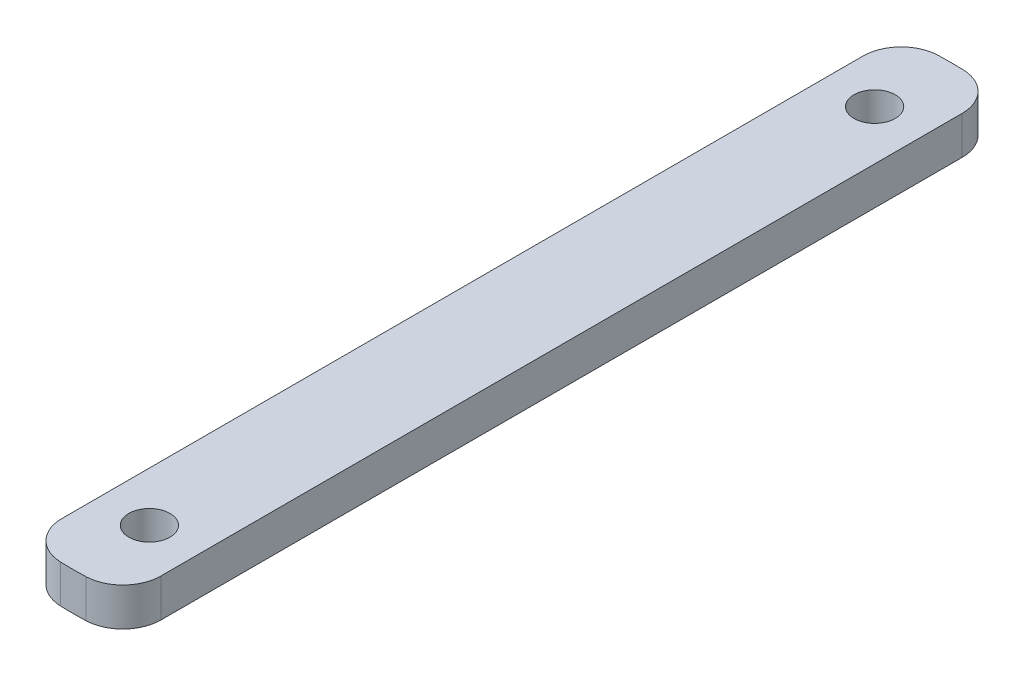
ISO-10303-21;
HEADER;
FILE_DESCRIPTION(('STEP AP214'),'2;1');
FILE_NAME('part.step','',(''),(''),'','','');
FILE_SCHEMA(('AUTOMOTIVE_DESIGN { 1 0 10303 214 1 1 1 1 }'));
ENDSEC;
DATA;
#1=APPLICATION_CONTEXT('core data for automotive mechanical design processes');
#2=APPLICATION_PROTOCOL_DEFINITION('international standard','automotive_design',2000,#1);
#3=PRODUCT_CONTEXT('',#1,'mechanical');
#4=PRODUCT('Part','Part','',(#3));
#5=PRODUCT_RELATED_PRODUCT_CATEGORY('part','',(#4));
#6=PRODUCT_DEFINITION_FORMATION('','',#4);
#7=PRODUCT_DEFINITION_CONTEXT('part definition',#1,'design');
#8=PRODUCT_DEFINITION('design','',#6,#7);
#9=PRODUCT_DEFINITION_SHAPE('','',#8);
#10=(LENGTH_UNIT() NAMED_UNIT(*) SI_UNIT(.MILLI.,.METRE.));
#11=(NAMED_UNIT(*) PLANE_ANGLE_UNIT() SI_UNIT($,.RADIAN.));
#12=(NAMED_UNIT(*) SI_UNIT($,.STERADIAN.) SOLID_ANGLE_UNIT());
#13=UNCERTAINTY_MEASURE_WITH_UNIT(LENGTH_MEASURE(1.E-05),#10,'distance_accuracy_value','');
#14=(GEOMETRIC_REPRESENTATION_CONTEXT(3) GLOBAL_UNCERTAINTY_ASSIGNED_CONTEXT((#13)) GLOBAL_UNIT_ASSIGNED_CONTEXT((#10,
#11,#12)) REPRESENTATION_CONTEXT('',''));
#15=CARTESIAN_POINT('',(0.,0.,0.));
#16=DIRECTION('',(0.,0.,1.));
#17=DIRECTION('',(1.,0.,0.));
#18=AXIS2_PLACEMENT_3D('',#15,#16,#17);
#19=CARTESIAN_POINT('',(0.,6.35,0.));
#20=DIRECTION('',(0.,-1.,0.));
#21=DIRECTION('',(0.,0.,-1.));
#22=AXIS2_PLACEMENT_3D('',#19,#20,#21);
#23=CYLINDRICAL_SURFACE('',#22,73.025);
#24=CARTESIAN_POINT('',(0.,6.35,0.));
#25=DIRECTION('',(0.,1.,0.));
#26=DIRECTION('',(0.,0.,1.));
#27=AXIS2_PLACEMENT_3D('',#24,#25,#26);
#28=CIRCLE('',#27,73.025);
#29=CARTESIAN_POINT('',(-2.08642857142859,6.35,72.9951877921848));
#30=VERTEX_POINT('',#29);
#31=CARTESIAN_POINT('',(2.08642857142859,6.35,72.9951877921848));
#32=VERTEX_POINT('',#31);
#33=EDGE_CURVE('E126',#30,#32,#28,.T.);
#34=ORIENTED_EDGE('',*,*,#33,.F.);
#35=DIRECTION('',(0.,-1.,0.));
#36=VECTOR('',#35,1.);
#37=CARTESIAN_POINT('',(-2.08642857142859,6.35,72.9951877921848));
#38=LINE('',#37,#36);
#39=CARTESIAN_POINT('',(-2.08642857142859,0.,72.9951877921848));
#40=VERTEX_POINT('',#39);
#41=EDGE_CURVE('E109',#30,#40,#38,.T.);
#42=ORIENTED_EDGE('',*,*,#41,.T.);
#43=CARTESIAN_POINT('',(0.,0.,0.));
#44=DIRECTION('',(0.,1.,0.));
#45=DIRECTION('',(0.,0.,1.));
#46=AXIS2_PLACEMENT_3D('',#43,#44,#45);
#47=CIRCLE('',#46,73.025);
#48=CARTESIAN_POINT('',(2.08642857142859,0.,72.9951877921848));
#49=VERTEX_POINT('',#48);
#50=EDGE_CURVE('E123',#40,#49,#47,.T.);
#51=ORIENTED_EDGE('',*,*,#50,.T.);
#52=DIRECTION('',(0.,-1.,0.));
#53=VECTOR('',#52,1.);
#54=CARTESIAN_POINT('',(2.08642857142859,6.35,72.9951877921848));
#55=LINE('',#54,#53);
#56=EDGE_CURVE('E129',#49,#32,#55,.F.);
#57=ORIENTED_EDGE('',*,*,#56,.T.);
#58=EDGE_LOOP('',(#34,#42,#51,#57));
#59=FACE_BOUND('',#58,.T.);
#60=ADVANCED_FACE('F37',(#59),#23,.T.);
#61=CARTESIAN_POINT('',(0.,6.35,0.));
#62=DIRECTION('',(0.,1.,0.));
#63=DIRECTION('',(0.,0.,1.));
#64=AXIS2_PLACEMENT_3D('',#61,#62,#63);
#65=PLANE('',#64);
#66=DIRECTION('',(0.,0.,-1.));
#67=VECTOR('',#66,1.);
#68=CARTESIAN_POINT('',(-8.25500000000002,6.35,-73.025));
#69=LINE('',#68,#67);
#70=CARTESIAN_POINT('',(-8.25500000000002,6.35,66.6477801580818));
#71=VERTEX_POINT('',#70);
#72=CARTESIAN_POINT('',(-8.25500000000002,6.35,-66.6477801580818));
#73=VERTEX_POINT('',#72);
#74=EDGE_CURVE('E212',#71,#73,#69,.T.);
#75=ORIENTED_EDGE('',*,*,#74,.F.);
#76=CARTESIAN_POINT('',(-1.90500000000002,6.35,66.6477801580818));
#77=DIRECTION('',(0.,1.,0.));
#78=DIRECTION('',(0.,0.,1.));
#79=AXIS2_PLACEMENT_3D('',#76,#77,#78);
#80=CIRCLE('',#79,6.35);
#81=EDGE_CURVE('E170',#71,#30,#80,.T.);
#82=ORIENTED_EDGE('',*,*,#81,.T.);
#83=ORIENTED_EDGE('',*,*,#33,.T.);
#84=CARTESIAN_POINT('',(1.90500000000002,6.35,66.6477801580818));
#85=DIRECTION('',(0.,1.,0.));
#86=DIRECTION('',(0.,0.,1.));
#87=AXIS2_PLACEMENT_3D('',#84,#85,#86);
#88=CIRCLE('',#87,6.35);
#89=CARTESIAN_POINT('',(8.25500000000002,6.35,66.6477801580818));
#90=VERTEX_POINT('',#89);
#91=EDGE_CURVE('E163',#32,#90,#88,.T.);
#92=ORIENTED_EDGE('',*,*,#91,.T.);
#93=DIRECTION('',(0.,0.,1.));
#94=VECTOR('',#93,1.);
#95=CARTESIAN_POINT('',(8.25500000000002,6.35,-73.025));
#96=LINE('',#95,#94);
#97=CARTESIAN_POINT('',(8.25500000000002,6.35,-66.6477801580818));
#98=VERTEX_POINT('',#97);
#99=EDGE_CURVE('E188',#98,#90,#96,.T.);
#100=ORIENTED_EDGE('',*,*,#99,.F.);
#101=CARTESIAN_POINT('',(1.90500000000002,6.35,-66.6477801580818));
#102=DIRECTION('',(0.,1.,0.));
#103=DIRECTION('',(0.,0.,1.));
#104=AXIS2_PLACEMENT_3D('',#101,#102,#103);
#105=CIRCLE('',#104,6.35);
#106=CARTESIAN_POINT('',(2.08642857142859,6.35,-72.9951877921848));
#107=VERTEX_POINT('',#106);
#108=EDGE_CURVE('E61',#98,#107,#105,.T.);
#109=ORIENTED_EDGE('',*,*,#108,.T.);
#110=CARTESIAN_POINT('',(-2.08642857142859,6.35,-72.9951877921848));
#111=VERTEX_POINT('',#110);
#112=EDGE_CURVE('E148',#107,#111,#28,.T.);
#113=ORIENTED_EDGE('',*,*,#112,.T.);
#114=CARTESIAN_POINT('',(-1.90500000000002,6.35,-66.6477801580818));
#115=DIRECTION('',(0.,1.,0.));
#116=DIRECTION('',(0.,0.,1.));
#117=AXIS2_PLACEMENT_3D('',#114,#115,#116);
#118=CIRCLE('',#117,6.35);
#119=EDGE_CURVE('E53',#111,#73,#118,.T.);
#120=ORIENTED_EDGE('',*,*,#119,.T.);
#121=EDGE_LOOP('',(#75,#82,#83,#92,#100,#109,#113,#120));
#122=FACE_BOUND('',#121,.T.);
#123=CARTESIAN_POINT('',(0.,6.35,-60.325));
#124=DIRECTION('',(0.,1.,0.));
#125=DIRECTION('',(0.,0.,1.));
#126=AXIS2_PLACEMENT_3D('',#123,#124,#125);
#127=CIRCLE('',#126,3.429);
#128=CARTESIAN_POINT('',(0.,6.35,-56.896));
#129=VERTEX_POINT('',#128);
#130=EDGE_CURVE('E137',#129,#129,#127,.T.);
#131=ORIENTED_EDGE('',*,*,#130,.F.);
#132=EDGE_LOOP('',(#131));
#133=FACE_BOUND('',#132,.T.);
#134=CARTESIAN_POINT('',(0.,6.35,60.325));
#135=DIRECTION('',(0.,1.,0.));
#136=DIRECTION('',(0.,0.,-1.));
#137=AXIS2_PLACEMENT_3D('',#134,#135,#136);
#138=CIRCLE('',#137,3.429);
#139=CARTESIAN_POINT('',(0.,6.35,56.896));
#140=VERTEX_POINT('',#139);
#141=EDGE_CURVE('E217',#140,#140,#138,.T.);
#142=ORIENTED_EDGE('',*,*,#141,.F.);
#143=EDGE_LOOP('',(#142));
#144=FACE_BOUND('',#143,.T.);
#145=ADVANCED_FACE('F195',(#122,#133,#144),#65,.T.);
#146=CARTESIAN_POINT('',(0.,0.,0.));
#147=DIRECTION('',(0.,1.,0.));
#148=DIRECTION('',(0.,0.,1.));
#149=AXIS2_PLACEMENT_3D('',#146,#147,#148);
#150=PLANE('',#149);
#151=ORIENTED_EDGE('',*,*,#50,.F.);
#152=CARTESIAN_POINT('',(-1.90500000000002,0.,66.6477801580818));
#153=DIRECTION('',(0.,1.,0.));
#154=DIRECTION('',(0.,0.,1.));
#155=AXIS2_PLACEMENT_3D('',#152,#153,#154);
#156=CIRCLE('',#155,6.35);
#157=CARTESIAN_POINT('',(-8.25500000000002,0.,66.6477801580818));
#158=VERTEX_POINT('',#157);
#159=EDGE_CURVE('E105',#40,#158,#156,.F.);
#160=ORIENTED_EDGE('',*,*,#159,.T.);
#161=DIRECTION('',(0.,0.,-1.));
#162=VECTOR('',#161,1.);
#163=CARTESIAN_POINT('',(-8.25500000000002,0.,-73.025));
#164=LINE('',#163,#162);
#165=CARTESIAN_POINT('',(-8.25500000000002,0.,-66.6477801580818));
#166=VERTEX_POINT('',#165);
#167=EDGE_CURVE('E208',#158,#166,#164,.T.);
#168=ORIENTED_EDGE('',*,*,#167,.T.);
#169=CARTESIAN_POINT('',(-1.90500000000002,0.,-66.6477801580818));
#170=DIRECTION('',(0.,1.,0.));
#171=DIRECTION('',(0.,0.,1.));
#172=AXIS2_PLACEMENT_3D('',#169,#170,#171);
#173=CIRCLE('',#172,6.35);
#174=CARTESIAN_POINT('',(-2.08642857142859,0.,-72.9951877921848));
#175=VERTEX_POINT('',#174);
#176=EDGE_CURVE('E117',#166,#175,#173,.F.);
#177=ORIENTED_EDGE('',*,*,#176,.T.);
#178=CARTESIAN_POINT('',(2.08642857142859,0.,-72.9951877921848));
#179=VERTEX_POINT('',#178);
#180=EDGE_CURVE('E136',#179,#175,#47,.T.);
#181=ORIENTED_EDGE('',*,*,#180,.F.);
#182=CARTESIAN_POINT('',(1.90500000000002,0.,-66.6477801580818));
#183=DIRECTION('',(0.,1.,0.));
#184=DIRECTION('',(0.,0.,1.));
#185=AXIS2_PLACEMENT_3D('',#182,#183,#184);
#186=CIRCLE('',#185,6.35);
#187=CARTESIAN_POINT('',(8.25500000000002,0.,-66.6477801580818));
#188=VERTEX_POINT('',#187);
#189=EDGE_CURVE('E154',#179,#188,#186,.F.);
#190=ORIENTED_EDGE('',*,*,#189,.T.);
#191=DIRECTION('',(0.,0.,1.));
#192=VECTOR('',#191,1.);
#193=CARTESIAN_POINT('',(8.25500000000002,0.,-73.025));
#194=LINE('',#193,#192);
#195=CARTESIAN_POINT('',(8.25500000000002,0.,66.6477801580818));
#196=VERTEX_POINT('',#195);
#197=EDGE_CURVE('E186',#188,#196,#194,.T.);
#198=ORIENTED_EDGE('',*,*,#197,.T.);
#199=CARTESIAN_POINT('',(1.90500000000002,0.,66.6477801580818));
#200=DIRECTION('',(0.,1.,0.));
#201=DIRECTION('',(0.,0.,1.));
#202=AXIS2_PLACEMENT_3D('',#199,#200,#201);
#203=CIRCLE('',#202,6.35);
#204=EDGE_CURVE('E128',#196,#49,#203,.F.);
#205=ORIENTED_EDGE('',*,*,#204,.T.);
#206=EDGE_LOOP('',(#151,#160,#168,#177,#181,#190,#198,#205));
#207=FACE_BOUND('',#206,.T.);
#208=CARTESIAN_POINT('',(0.,0.,-60.325));
#209=DIRECTION('',(0.,1.,0.));
#210=DIRECTION('',(0.,0.,1.));
#211=AXIS2_PLACEMENT_3D('',#208,#209,#210);
#212=CIRCLE('',#211,3.429);
#213=CARTESIAN_POINT('',(0.,0.,-56.896));
#214=VERTEX_POINT('',#213);
#215=EDGE_CURVE('E144',#214,#214,#212,.T.);
#216=ORIENTED_EDGE('',*,*,#215,.T.);
#217=EDGE_LOOP('',(#216));
#218=FACE_BOUND('',#217,.T.);
#219=CARTESIAN_POINT('',(0.,0.,60.325));
#220=DIRECTION('',(0.,1.,0.));
#221=DIRECTION('',(0.,0.,-1.));
#222=AXIS2_PLACEMENT_3D('',#219,#220,#221);
#223=CIRCLE('',#222,3.429);
#224=CARTESIAN_POINT('',(0.,0.,56.896));
#225=VERTEX_POINT('',#224);
#226=EDGE_CURVE('E192',#225,#225,#223,.T.);
#227=ORIENTED_EDGE('',*,*,#226,.T.);
#228=EDGE_LOOP('',(#227));
#229=FACE_BOUND('',#228,.T.);
#230=ADVANCED_FACE('F131',(#207,#218,#229),#150,.F.);
#231=ORIENTED_EDGE('',*,*,#180,.T.);
#232=DIRECTION('',(0.,-1.,0.));
#233=VECTOR('',#232,1.);
#234=CARTESIAN_POINT('',(-2.08642857142859,6.35,-72.9951877921848));
#235=LINE('',#234,#233);
#236=EDGE_CURVE('E177',#175,#111,#235,.F.);
#237=ORIENTED_EDGE('',*,*,#236,.T.);
#238=ORIENTED_EDGE('',*,*,#112,.F.);
#239=DIRECTION('',(0.,-1.,0.));
#240=VECTOR('',#239,1.);
#241=CARTESIAN_POINT('',(2.08642857142859,6.35,-72.9951877921848));
#242=LINE('',#241,#240);
#243=EDGE_CURVE('E173',#107,#179,#242,.T.);
#244=ORIENTED_EDGE('',*,*,#243,.T.);
#245=EDGE_LOOP('',(#231,#237,#238,#244));
#246=FACE_BOUND('',#245,.T.);
#247=ADVANCED_FACE('F204',(#246),#23,.T.);
#248=CARTESIAN_POINT('',(0.,6.35,-60.325));
#249=DIRECTION('',(0.,-1.,0.));
#250=DIRECTION('',(0.,0.,-1.));
#251=AXIS2_PLACEMENT_3D('',#248,#249,#250);
#252=CYLINDRICAL_SURFACE('',#251,3.429);
#253=ORIENTED_EDGE('',*,*,#130,.T.);
#254=EDGE_LOOP('',(#253));
#255=FACE_BOUND('',#254,.T.);
#256=ORIENTED_EDGE('',*,*,#215,.F.);
#257=EDGE_LOOP('',(#256));
#258=FACE_BOUND('',#257,.T.);
#259=ADVANCED_FACE('F229',(#255,#258),#252,.F.);
#260=CARTESIAN_POINT('',(0.,6.35,60.325));
#261=DIRECTION('',(0.,-1.,0.));
#262=DIRECTION('',(0.,0.,-1.));
#263=AXIS2_PLACEMENT_3D('',#260,#261,#262);
#264=CYLINDRICAL_SURFACE('',#263,3.429);
#265=ORIENTED_EDGE('',*,*,#141,.T.);
#266=EDGE_LOOP('',(#265));
#267=FACE_BOUND('',#266,.T.);
#268=ORIENTED_EDGE('',*,*,#226,.F.);
#269=EDGE_LOOP('',(#268));
#270=FACE_BOUND('',#269,.T.);
#271=ADVANCED_FACE('F231',(#267,#270),#264,.F.);
#272=CARTESIAN_POINT('',(-8.25500000000002,0.,-73.025));
#273=DIRECTION('',(1.,0.,0.));
#274=DIRECTION('',(0.,0.,-1.));
#275=AXIS2_PLACEMENT_3D('',#272,#273,#274);
#276=PLANE('',#275);
#277=ORIENTED_EDGE('',*,*,#167,.F.);
#278=DIRECTION('',(0.,-1.,0.));
#279=VECTOR('',#278,1.);
#280=CARTESIAN_POINT('',(-8.25500000000002,0.,66.6477801580818));
#281=LINE('',#280,#279);
#282=EDGE_CURVE('E110',#158,#71,#281,.F.);
#283=ORIENTED_EDGE('',*,*,#282,.T.);
#284=ORIENTED_EDGE('',*,*,#74,.T.);
#285=DIRECTION('',(0.,-1.,0.));
#286=VECTOR('',#285,1.);
#287=CARTESIAN_POINT('',(-8.25500000000002,0.,-66.6477801580818));
#288=LINE('',#287,#286);
#289=EDGE_CURVE('E116',#73,#166,#288,.T.);
#290=ORIENTED_EDGE('',*,*,#289,.T.);
#291=EDGE_LOOP('',(#277,#283,#284,#290));
#292=FACE_BOUND('',#291,.T.);
#293=ADVANCED_FACE('F238',(#292),#276,.F.);
#294=CARTESIAN_POINT('',(8.25500000000002,0.,-73.025));
#295=DIRECTION('',(-1.,0.,0.));
#296=DIRECTION('',(0.,0.,1.));
#297=AXIS2_PLACEMENT_3D('',#294,#295,#296);
#298=PLANE('',#297);
#299=ORIENTED_EDGE('',*,*,#197,.F.);
#300=DIRECTION('',(0.,-1.,0.));
#301=VECTOR('',#300,1.);
#302=CARTESIAN_POINT('',(8.25500000000002,0.,-66.6477801580818));
#303=LINE('',#302,#301);
#304=EDGE_CURVE('E11',#188,#98,#303,.F.);
#305=ORIENTED_EDGE('',*,*,#304,.T.);
#306=ORIENTED_EDGE('',*,*,#99,.T.);
#307=DIRECTION('',(0.,-1.,0.));
#308=VECTOR('',#307,1.);
#309=CARTESIAN_POINT('',(8.25500000000002,0.,66.6477801580818));
#310=LINE('',#309,#308);
#311=EDGE_CURVE('E46',#90,#196,#310,.T.);
#312=ORIENTED_EDGE('',*,*,#311,.T.);
#313=EDGE_LOOP('',(#299,#305,#306,#312));
#314=FACE_BOUND('',#313,.T.);
#315=ADVANCED_FACE('F185',(#314),#298,.F.);
#316=CARTESIAN_POINT('',(-1.90500000000002,6.35,66.6477801580818));
#317=DIRECTION('',(0.,-1.,0.));
#318=DIRECTION('',(0.,0.,-1.));
#319=AXIS2_PLACEMENT_3D('',#316,#317,#318);
#320=CYLINDRICAL_SURFACE('',#319,6.35);
#321=ORIENTED_EDGE('',*,*,#81,.F.);
#322=ORIENTED_EDGE('',*,*,#282,.F.);
#323=ORIENTED_EDGE('',*,*,#159,.F.);
#324=ORIENTED_EDGE('',*,*,#41,.F.);
#325=EDGE_LOOP('',(#321,#322,#323,#324));
#326=FACE_BOUND('',#325,.T.);
#327=ADVANCED_FACE('F108',(#326),#320,.T.);
#328=CARTESIAN_POINT('',(-1.90500000000002,6.35,-66.6477801580818));
#329=DIRECTION('',(0.,-1.,0.));
#330=DIRECTION('',(0.,0.,-1.));
#331=AXIS2_PLACEMENT_3D('',#328,#329,#330);
#332=CYLINDRICAL_SURFACE('',#331,6.35);
#333=ORIENTED_EDGE('',*,*,#176,.F.);
#334=ORIENTED_EDGE('',*,*,#289,.F.);
#335=ORIENTED_EDGE('',*,*,#119,.F.);
#336=ORIENTED_EDGE('',*,*,#236,.F.);
#337=EDGE_LOOP('',(#333,#334,#335,#336));
#338=FACE_BOUND('',#337,.T.);
#339=ADVANCED_FACE('F251',(#338),#332,.T.);
#340=CARTESIAN_POINT('',(1.90500000000002,6.35,-66.6477801580818));
#341=DIRECTION('',(0.,-1.,0.));
#342=DIRECTION('',(0.,0.,-1.));
#343=AXIS2_PLACEMENT_3D('',#340,#341,#342);
#344=CYLINDRICAL_SURFACE('',#343,6.35);
#345=ORIENTED_EDGE('',*,*,#108,.F.);
#346=ORIENTED_EDGE('',*,*,#304,.F.);
#347=ORIENTED_EDGE('',*,*,#189,.F.);
#348=ORIENTED_EDGE('',*,*,#243,.F.);
#349=EDGE_LOOP('',(#345,#346,#347,#348));
#350=FACE_BOUND('',#349,.T.);
#351=ADVANCED_FACE('F206',(#350),#344,.T.);
#352=CARTESIAN_POINT('',(1.90500000000002,6.35,66.6477801580818));
#353=DIRECTION('',(0.,-1.,0.));
#354=DIRECTION('',(0.,0.,-1.));
#355=AXIS2_PLACEMENT_3D('',#352,#353,#354);
#356=CYLINDRICAL_SURFACE('',#355,6.35);
#357=ORIENTED_EDGE('',*,*,#204,.F.);
#358=ORIENTED_EDGE('',*,*,#311,.F.);
#359=ORIENTED_EDGE('',*,*,#91,.F.);
#360=ORIENTED_EDGE('',*,*,#56,.F.);
#361=EDGE_LOOP('',(#357,#358,#359,#360));
#362=FACE_BOUND('',#361,.T.);
#363=ADVANCED_FACE('F39',(#362),#356,.T.);
#364=CLOSED_SHELL('',(#60,#145,#230,#247,#259,#271,#293,#315,#327,#339,#351,#363));
#365=MANIFOLD_SOLID_BREP('B2',#364);
#366=ADVANCED_BREP_SHAPE_REPRESENTATION('',(#18,#365),#14);
#367=SHAPE_DEFINITION_REPRESENTATION(#9,#366);
ENDSEC;
END-ISO-10303-21;
